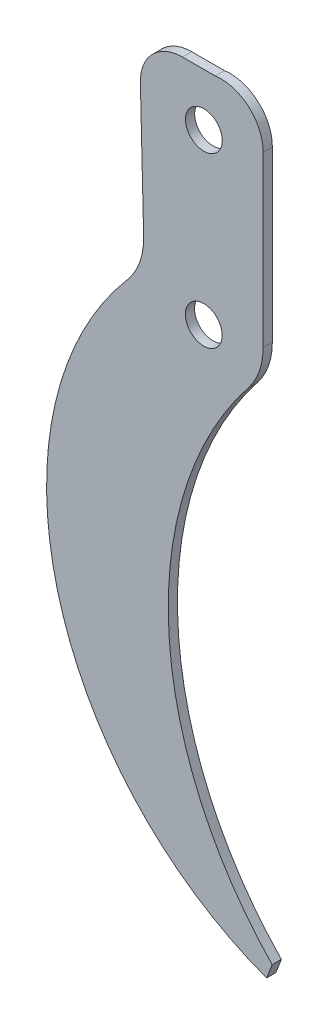
ISO-10303-21;
HEADER;
FILE_DESCRIPTION(('STEP AP214'),'2;1');
FILE_NAME('part.step','',(''),(''),'','','');
FILE_SCHEMA(('AUTOMOTIVE_DESIGN { 1 0 10303 214 1 1 1 1 }'));
ENDSEC;
DATA;
#1=APPLICATION_CONTEXT('core data for automotive mechanical design processes');
#2=APPLICATION_PROTOCOL_DEFINITION('international standard','automotive_design',2000,#1);
#3=PRODUCT_CONTEXT('',#1,'mechanical');
#4=PRODUCT('Part','Part','',(#3));
#5=PRODUCT_RELATED_PRODUCT_CATEGORY('part','',(#4));
#6=PRODUCT_DEFINITION_FORMATION('','',#4);
#7=PRODUCT_DEFINITION_CONTEXT('part definition',#1,'design');
#8=PRODUCT_DEFINITION('design','',#6,#7);
#9=PRODUCT_DEFINITION_SHAPE('','',#8);
#10=(LENGTH_UNIT() NAMED_UNIT(*) SI_UNIT(.MILLI.,.METRE.));
#11=(NAMED_UNIT(*) PLANE_ANGLE_UNIT() SI_UNIT($,.RADIAN.));
#12=(NAMED_UNIT(*) SI_UNIT($,.STERADIAN.) SOLID_ANGLE_UNIT());
#13=UNCERTAINTY_MEASURE_WITH_UNIT(LENGTH_MEASURE(1.E-05),#10,'distance_accuracy_value','');
#14=(GEOMETRIC_REPRESENTATION_CONTEXT(3) GLOBAL_UNCERTAINTY_ASSIGNED_CONTEXT((#13)) GLOBAL_UNIT_ASSIGNED_CONTEXT((#10,
#11,#12)) REPRESENTATION_CONTEXT('',''));
#15=CARTESIAN_POINT('',(0.,0.,0.));
#16=DIRECTION('',(0.,0.,1.));
#17=DIRECTION('',(1.,0.,0.));
#18=AXIS2_PLACEMENT_3D('',#15,#16,#17);
#19=CARTESIAN_POINT('',(7127.77049573772,3294.93047297352,15.));
#20=DIRECTION('',(0.,0.,1.));
#21=DIRECTION('',(1.,0.,0.));
#22=AXIS2_PLACEMENT_3D('',#19,#20,#21);
#23=PLANE('',#22);
#24=CARTESIAN_POINT('',(7127.77049573772,3294.93047297352,15.));
#25=DIRECTION('',(0.,0.,1.));
#26=DIRECTION('',(1.,0.,0.));
#27=AXIS2_PLACEMENT_3D('',#24,#25,#26);
#28=CIRCLE('',#27,549.387659983748);
#29=CARTESIAN_POINT('',(6710.2050521168,3651.95414338779,15.));
#30=VERTEX_POINT('',#29);
#31=CARTESIAN_POINT('',(6936.87895507785,2779.77300127489,15.));
#32=VERTEX_POINT('',#31);
#33=EDGE_CURVE('E145',#30,#32,#28,.T.);
#34=ORIENTED_EDGE('',*,*,#33,.T.);
#35=DIRECTION('',(0.362479633940397,0.931991692547973,0.));
#36=VECTOR('',#35,1.);
#37=CARTESIAN_POINT('',(6945.94094592636,2803.07279358859,15.));
#38=LINE('',#37,#36);
#39=CARTESIAN_POINT('',(6945.94094592636,2803.07279358859,15.));
#40=VERTEX_POINT('',#39);
#41=EDGE_CURVE('E83',#32,#40,#38,.T.);
#42=ORIENTED_EDGE('',*,*,#41,.T.);
#43=CARTESIAN_POINT('',(7380.92244872364,3222.59814605796,15.));
#44=DIRECTION('',(0.,0.,-1.));
#45=DIRECTION('',(1.,0.,0.));
#46=AXIS2_PLACEMENT_3D('',#43,#44,#45);
#47=CIRCLE('',#46,604.326425982123);
#48=CARTESIAN_POINT('',(6907.31914174979,3597.97840228325,15.));
#49=VERTEX_POINT('',#48);
#50=EDGE_CURVE('E166',#40,#49,#47,.T.);
#51=ORIENTED_EDGE('',*,*,#50,.T.);
#52=CARTESIAN_POINT('',(6821.31679547886,3666.36457393798,15.));
#53=DIRECTION('',(0.,0.,1.));
#54=DIRECTION('',(1.,0.,0.));
#55=AXIS2_PLACEMENT_3D('',#52,#53,#54);
#56=CIRCLE('',#55,109.877531996749);
#57=CARTESIAN_POINT('',(6931.19432747561,3666.36457393798,15.));
#58=VERTEX_POINT('',#57);
#59=EDGE_CURVE('E185',#49,#58,#56,.T.);
#60=ORIENTED_EDGE('',*,*,#59,.T.);
#61=DIRECTION('',(0.,1.,0.));
#62=VECTOR('',#61,1.);
#63=CARTESIAN_POINT('',(6931.19432747561,3942.08605991255,15.));
#64=LINE('',#63,#62);
#65=CARTESIAN_POINT('',(6931.19432747561,3942.08605991255,15.));
#66=VERTEX_POINT('',#65);
#67=EDGE_CURVE('E182',#58,#66,#64,.T.);
#68=ORIENTED_EDGE('',*,*,#67,.T.);
#69=CARTESIAN_POINT('',(6862.52400653347,3942.74240313722,15.));
#70=DIRECTION('',(0.,0.,1.));
#71=DIRECTION('',(1.,0.,0.));
#72=AXIS2_PLACEMENT_3D('',#69,#70,#71);
#73=CIRCLE('',#72,68.6734574979682);
#74=CARTESIAN_POINT('',(6853.05215715453,4010.75951741052,15.));
#75=VERTEX_POINT('',#74);
#76=EDGE_CURVE('E184',#66,#75,#73,.T.);
#77=ORIENTED_EDGE('',*,*,#76,.T.);
#78=DIRECTION('',(-1.,0.,0.));
#79=VECTOR('',#78,1.);
#80=CARTESIAN_POINT('',(6799.84646166127,4010.75951741052,15.));
#81=LINE('',#80,#79);
#82=CARTESIAN_POINT('',(6799.84646166127,4010.75951741052,15.));
#83=VERTEX_POINT('',#82);
#84=EDGE_CURVE('E108',#75,#83,#81,.T.);
#85=ORIENTED_EDGE('',*,*,#84,.T.);
#86=CARTESIAN_POINT('',(6799.84646166127,3942.08605991255,15.));
#87=DIRECTION('',(0.,0.,1.));
#88=DIRECTION('',(1.,0.,0.));
#89=AXIS2_PLACEMENT_3D('',#86,#87,#88);
#90=CIRCLE('',#89,68.6734574979682);
#91=CARTESIAN_POINT('',(6731.19432747561,3940.37485084327,15.));
#92=VERTEX_POINT('',#91);
#93=EDGE_CURVE('E102',#83,#92,#90,.T.);
#94=ORIENTED_EDGE('',*,*,#93,.T.);
#95=DIRECTION('',(0.0249180561402346,-0.99968949703305,0.));
#96=VECTOR('',#95,1.);
#97=CARTESIAN_POINT('',(6736.53537808965,3726.09681198145,15.));
#98=LINE('',#97,#96);
#99=CARTESIAN_POINT('',(6736.53537808965,3726.09681198145,15.));
#100=VERTEX_POINT('',#99);
#101=EDGE_CURVE('E106',#92,#100,#98,.T.);
#102=ORIENTED_EDGE('',*,*,#101,.T.);
#103=CARTESIAN_POINT('',(6626.69196339258,3723.35887747061,15.));
#104=DIRECTION('',(0.,0.,-1.));
#105=DIRECTION('',(1.,0.,0.));
#106=AXIS2_PLACEMENT_3D('',#103,#104,#105);
#107=CIRCLE('',#106,109.877531996749);
#108=EDGE_CURVE('E34',#100,#30,#107,.T.);
#109=ORIENTED_EDGE('',*,*,#108,.T.);
#110=EDGE_LOOP('',(#34,#42,#51,#60,#68,#77,#85,#94,#102,#109));
#111=FACE_BOUND('',#110,.T.);
#112=CARTESIAN_POINT('',(6834.46924200168,3650.21863180757,15.));
#113=DIRECTION('',(0.,0.,1.));
#114=DIRECTION('',(1.,0.,0.));
#115=AXIS2_PLACEMENT_3D('',#112,#113,#114);
#116=CIRCLE('',#115,30.);
#117=CARTESIAN_POINT('',(6864.46924200168,3650.21863180757,15.));
#118=VERTEX_POINT('',#117);
#119=EDGE_CURVE('E195',#118,#118,#116,.T.);
#120=ORIENTED_EDGE('',*,*,#119,.F.);
#121=EDGE_LOOP('',(#120));
#122=FACE_BOUND('',#121,.T.);
#123=CARTESIAN_POINT('',(6834.63264710738,3925.21863180757,15.));
#124=DIRECTION('',(0.,0.,1.));
#125=DIRECTION('',(1.,0.,0.));
#126=AXIS2_PLACEMENT_3D('',#123,#124,#125);
#127=CIRCLE('',#126,30.);
#128=CARTESIAN_POINT('',(6864.63264710738,3925.21863180757,15.));
#129=VERTEX_POINT('',#128);
#130=EDGE_CURVE('E201',#129,#129,#127,.T.);
#131=ORIENTED_EDGE('',*,*,#130,.F.);
#132=EDGE_LOOP('',(#131));
#133=FACE_BOUND('',#132,.T.);
#134=ADVANCED_FACE('F17',(#111,#122,#133),#23,.T.);
#135=CARTESIAN_POINT('',(7127.77049573772,3294.93047297352,0.));
#136=DIRECTION('',(0.,0.,1.));
#137=DIRECTION('',(1.,0.,0.));
#138=AXIS2_PLACEMENT_3D('',#135,#136,#137);
#139=PLANE('',#138);
#140=CARTESIAN_POINT('',(7127.77049573772,3294.93047297352,0.));
#141=DIRECTION('',(0.,0.,1.));
#142=DIRECTION('',(1.,0.,0.));
#143=AXIS2_PLACEMENT_3D('',#140,#141,#142);
#144=CIRCLE('',#143,549.387659983748);
#145=CARTESIAN_POINT('',(6710.2050521168,3651.95414338779,0.));
#146=VERTEX_POINT('',#145);
#147=CARTESIAN_POINT('',(6936.87895507785,2779.77300127489,0.));
#148=VERTEX_POINT('',#147);
#149=EDGE_CURVE('E126',#146,#148,#144,.T.);
#150=ORIENTED_EDGE('',*,*,#149,.F.);
#151=CARTESIAN_POINT('',(6626.69196339258,3723.35887747061,0.));
#152=DIRECTION('',(0.,0.,-1.));
#153=DIRECTION('',(1.,0.,0.));
#154=AXIS2_PLACEMENT_3D('',#151,#152,#153);
#155=CIRCLE('',#154,109.877531996749);
#156=CARTESIAN_POINT('',(6736.53537808965,3726.09681198145,0.));
#157=VERTEX_POINT('',#156);
#158=EDGE_CURVE('E75',#157,#146,#155,.T.);
#159=ORIENTED_EDGE('',*,*,#158,.F.);
#160=DIRECTION('',(0.0249180561402346,-0.99968949703305,0.));
#161=VECTOR('',#160,1.);
#162=CARTESIAN_POINT('',(6736.53537808965,3726.09681198145,0.));
#163=LINE('',#162,#161);
#164=CARTESIAN_POINT('',(6731.19432747561,3940.37485084327,0.));
#165=VERTEX_POINT('',#164);
#166=EDGE_CURVE('E69',#165,#157,#163,.T.);
#167=ORIENTED_EDGE('',*,*,#166,.F.);
#168=CARTESIAN_POINT('',(6799.84646166127,3942.08605991255,0.));
#169=DIRECTION('',(0.,0.,1.));
#170=DIRECTION('',(1.,0.,0.));
#171=AXIS2_PLACEMENT_3D('',#168,#169,#170);
#172=CIRCLE('',#171,68.6734574979682);
#173=CARTESIAN_POINT('',(6799.84646166127,4010.75951741052,0.));
#174=VERTEX_POINT('',#173);
#175=EDGE_CURVE('E116',#174,#165,#172,.T.);
#176=ORIENTED_EDGE('',*,*,#175,.F.);
#177=DIRECTION('',(-1.,0.,0.));
#178=VECTOR('',#177,1.);
#179=CARTESIAN_POINT('',(6799.84646166127,4010.75951741052,0.));
#180=LINE('',#179,#178);
#181=CARTESIAN_POINT('',(6853.05215715453,4010.75951741052,0.));
#182=VERTEX_POINT('',#181);
#183=EDGE_CURVE('E140',#182,#174,#180,.T.);
#184=ORIENTED_EDGE('',*,*,#183,.F.);
#185=CARTESIAN_POINT('',(6862.52400653347,3942.74240313722,0.));
#186=DIRECTION('',(0.,0.,1.));
#187=DIRECTION('',(1.,0.,0.));
#188=AXIS2_PLACEMENT_3D('',#185,#186,#187);
#189=CIRCLE('',#188,68.6734574979682);
#190=CARTESIAN_POINT('',(6931.19432747561,3942.08605991255,0.));
#191=VERTEX_POINT('',#190);
#192=EDGE_CURVE('E138',#191,#182,#189,.T.);
#193=ORIENTED_EDGE('',*,*,#192,.F.);
#194=DIRECTION('',(0.,1.,0.));
#195=VECTOR('',#194,1.);
#196=CARTESIAN_POINT('',(6931.19432747561,3942.08605991255,0.));
#197=LINE('',#196,#195);
#198=CARTESIAN_POINT('',(6931.19432747561,3666.36457393798,0.));
#199=VERTEX_POINT('',#198);
#200=EDGE_CURVE('E136',#199,#191,#197,.T.);
#201=ORIENTED_EDGE('',*,*,#200,.F.);
#202=CARTESIAN_POINT('',(6821.31679547886,3666.36457393798,0.));
#203=DIRECTION('',(0.,0.,1.));
#204=DIRECTION('',(1.,0.,0.));
#205=AXIS2_PLACEMENT_3D('',#202,#203,#204);
#206=CIRCLE('',#205,109.877531996749);
#207=CARTESIAN_POINT('',(6907.31914174979,3597.97840228325,0.));
#208=VERTEX_POINT('',#207);
#209=EDGE_CURVE('E134',#208,#199,#206,.T.);
#210=ORIENTED_EDGE('',*,*,#209,.F.);
#211=CARTESIAN_POINT('',(7380.92244872364,3222.59814605796,0.));
#212=DIRECTION('',(0.,0.,-1.));
#213=DIRECTION('',(1.,0.,0.));
#214=AXIS2_PLACEMENT_3D('',#211,#212,#213);
#215=CIRCLE('',#214,604.326425982123);
#216=CARTESIAN_POINT('',(6945.94094592636,2803.07279358859,0.));
#217=VERTEX_POINT('',#216);
#218=EDGE_CURVE('E132',#217,#208,#215,.T.);
#219=ORIENTED_EDGE('',*,*,#218,.F.);
#220=DIRECTION('',(0.362479633940397,0.931991692547973,0.));
#221=VECTOR('',#220,1.);
#222=CARTESIAN_POINT('',(6945.94094592636,2803.07279358859,0.));
#223=LINE('',#222,#221);
#224=EDGE_CURVE('E129',#148,#217,#223,.T.);
#225=ORIENTED_EDGE('',*,*,#224,.F.);
#226=EDGE_LOOP('',(#150,#159,#167,#176,#184,#193,#201,#210,#219,#225));
#227=FACE_BOUND('',#226,.T.);
#228=CARTESIAN_POINT('',(6834.46924200168,3650.21863180757,0.));
#229=DIRECTION('',(0.,0.,1.));
#230=DIRECTION('',(1.,0.,0.));
#231=AXIS2_PLACEMENT_3D('',#228,#229,#230);
#232=CIRCLE('',#231,30.);
#233=CARTESIAN_POINT('',(6864.46924200168,3650.21863180757,0.));
#234=VERTEX_POINT('',#233);
#235=EDGE_CURVE('E130',#234,#234,#232,.F.);
#236=ORIENTED_EDGE('',*,*,#235,.F.);
#237=EDGE_LOOP('',(#236));
#238=FACE_BOUND('',#237,.T.);
#239=CARTESIAN_POINT('',(6834.63264710738,3925.21863180757,0.));
#240=DIRECTION('',(0.,0.,1.));
#241=DIRECTION('',(1.,0.,0.));
#242=AXIS2_PLACEMENT_3D('',#239,#240,#241);
#243=CIRCLE('',#242,30.);
#244=CARTESIAN_POINT('',(6864.63264710738,3925.21863180757,0.));
#245=VERTEX_POINT('',#244);
#246=EDGE_CURVE('E198',#245,#245,#243,.F.);
#247=ORIENTED_EDGE('',*,*,#246,.F.);
#248=EDGE_LOOP('',(#247));
#249=FACE_BOUND('',#248,.T.);
#250=ADVANCED_FACE('F170',(#227,#238,#249),#139,.F.);
#251=CARTESIAN_POINT('',(7127.77049573772,3294.93047297352,15.));
#252=DIRECTION('',(0.,0.,-1.));
#253=DIRECTION('',(-1.,0.,0.));
#254=AXIS2_PLACEMENT_3D('',#251,#252,#253);
#255=CYLINDRICAL_SURFACE('',#254,549.387659983748);
#256=ORIENTED_EDGE('',*,*,#149,.T.);
#257=DIRECTION('',(0.,0.,-1.));
#258=VECTOR('',#257,1.);
#259=CARTESIAN_POINT('',(6936.87895507785,2779.77300127489,15.));
#260=LINE('',#259,#258);
#261=EDGE_CURVE('E11',#32,#148,#260,.T.);
#262=ORIENTED_EDGE('',*,*,#261,.F.);
#263=ORIENTED_EDGE('',*,*,#33,.F.);
#264=DIRECTION('',(0.,0.,-1.));
#265=VECTOR('',#264,1.);
#266=CARTESIAN_POINT('',(6710.2050521168,3651.95414338779,15.));
#267=LINE('',#266,#265);
#268=EDGE_CURVE('E122',#30,#146,#267,.T.);
#269=ORIENTED_EDGE('',*,*,#268,.T.);
#270=EDGE_LOOP('',(#256,#262,#263,#269));
#271=FACE_BOUND('',#270,.T.);
#272=ADVANCED_FACE('F19',(#271),#255,.T.);
#273=CARTESIAN_POINT('',(6945.94094592636,2803.07279358859,15.));
#274=DIRECTION('',(-0.931991692547973,0.362479633940397,0.));
#275=DIRECTION('',(-0.362479633940397,-0.931991692547973,0.));
#276=AXIS2_PLACEMENT_3D('',#273,#274,#275);
#277=PLANE('',#276);
#278=ORIENTED_EDGE('',*,*,#224,.T.);
#279=DIRECTION('',(0.,0.,-1.));
#280=VECTOR('',#279,1.);
#281=CARTESIAN_POINT('',(6945.94094592636,2803.07279358859,15.));
#282=LINE('',#281,#280);
#283=EDGE_CURVE('E26',#40,#217,#282,.T.);
#284=ORIENTED_EDGE('',*,*,#283,.F.);
#285=ORIENTED_EDGE('',*,*,#41,.F.);
#286=ORIENTED_EDGE('',*,*,#261,.T.);
#287=EDGE_LOOP('',(#278,#284,#285,#286));
#288=FACE_BOUND('',#287,.T.);
#289=ADVANCED_FACE('F239',(#288),#277,.F.);
#290=CARTESIAN_POINT('',(7380.92244872364,3222.59814605796,15.));
#291=DIRECTION('',(0.,0.,-1.));
#292=DIRECTION('',(-1.,0.,0.));
#293=AXIS2_PLACEMENT_3D('',#290,#291,#292);
#294=CYLINDRICAL_SURFACE('',#293,604.326425982123);
#295=ORIENTED_EDGE('',*,*,#218,.T.);
#296=DIRECTION('',(0.,0.,-1.));
#297=VECTOR('',#296,1.);
#298=CARTESIAN_POINT('',(6907.31914174979,3597.97840228325,15.));
#299=LINE('',#298,#297);
#300=EDGE_CURVE('E158',#49,#208,#299,.T.);
#301=ORIENTED_EDGE('',*,*,#300,.F.);
#302=ORIENTED_EDGE('',*,*,#50,.F.);
#303=ORIENTED_EDGE('',*,*,#283,.T.);
#304=EDGE_LOOP('',(#295,#301,#302,#303));
#305=FACE_BOUND('',#304,.T.);
#306=ADVANCED_FACE('F164',(#305),#294,.F.);
#307=CARTESIAN_POINT('',(6821.31679547886,3666.36457393798,15.));
#308=DIRECTION('',(0.,0.,-1.));
#309=DIRECTION('',(-1.,0.,0.));
#310=AXIS2_PLACEMENT_3D('',#307,#308,#309);
#311=CYLINDRICAL_SURFACE('',#310,109.877531996749);
#312=ORIENTED_EDGE('',*,*,#209,.T.);
#313=DIRECTION('',(0.,0.,-1.));
#314=VECTOR('',#313,1.);
#315=CARTESIAN_POINT('',(6931.19432747561,3666.36457393798,15.));
#316=LINE('',#315,#314);
#317=EDGE_CURVE('E155',#58,#199,#316,.T.);
#318=ORIENTED_EDGE('',*,*,#317,.F.);
#319=ORIENTED_EDGE('',*,*,#59,.F.);
#320=ORIENTED_EDGE('',*,*,#300,.T.);
#321=EDGE_LOOP('',(#312,#318,#319,#320));
#322=FACE_BOUND('',#321,.T.);
#323=ADVANCED_FACE('F176',(#322),#311,.T.);
#324=CARTESIAN_POINT('',(6931.19432747561,3942.08605991255,15.));
#325=DIRECTION('',(-1.,0.,0.));
#326=DIRECTION('',(0.,0.,1.));
#327=AXIS2_PLACEMENT_3D('',#324,#325,#326);
#328=PLANE('',#327);
#329=ORIENTED_EDGE('',*,*,#200,.T.);
#330=DIRECTION('',(0.,0.,-1.));
#331=VECTOR('',#330,1.);
#332=CARTESIAN_POINT('',(6931.19432747561,3942.08605991255,15.));
#333=LINE('',#332,#331);
#334=EDGE_CURVE('E152',#66,#191,#333,.T.);
#335=ORIENTED_EDGE('',*,*,#334,.F.);
#336=ORIENTED_EDGE('',*,*,#67,.F.);
#337=ORIENTED_EDGE('',*,*,#317,.T.);
#338=EDGE_LOOP('',(#329,#335,#336,#337));
#339=FACE_BOUND('',#338,.T.);
#340=ADVANCED_FACE('F180',(#339),#328,.F.);
#341=CARTESIAN_POINT('',(6862.52400653347,3942.74240313722,15.));
#342=DIRECTION('',(0.,0.,-1.));
#343=DIRECTION('',(-1.,0.,0.));
#344=AXIS2_PLACEMENT_3D('',#341,#342,#343);
#345=CYLINDRICAL_SURFACE('',#344,68.6734574979682);
#346=ORIENTED_EDGE('',*,*,#192,.T.);
#347=DIRECTION('',(0.,0.,-1.));
#348=VECTOR('',#347,1.);
#349=CARTESIAN_POINT('',(6853.05215715453,4010.75951741052,15.));
#350=LINE('',#349,#348);
#351=EDGE_CURVE('E149',#75,#182,#350,.T.);
#352=ORIENTED_EDGE('',*,*,#351,.F.);
#353=ORIENTED_EDGE('',*,*,#76,.F.);
#354=ORIENTED_EDGE('',*,*,#334,.T.);
#355=EDGE_LOOP('',(#346,#352,#353,#354));
#356=FACE_BOUND('',#355,.T.);
#357=ADVANCED_FACE('F229',(#356),#345,.T.);
#358=CARTESIAN_POINT('',(6799.84646166127,4010.75951741052,15.));
#359=DIRECTION('',(0.,-1.,0.));
#360=DIRECTION('',(1.,0.,0.));
#361=AXIS2_PLACEMENT_3D('',#358,#359,#360);
#362=PLANE('',#361);
#363=ORIENTED_EDGE('',*,*,#183,.T.);
#364=DIRECTION('',(0.,0.,-1.));
#365=VECTOR('',#364,1.);
#366=CARTESIAN_POINT('',(6799.84646166127,4010.75951741052,15.));
#367=LINE('',#366,#365);
#368=EDGE_CURVE('E117',#83,#174,#367,.T.);
#369=ORIENTED_EDGE('',*,*,#368,.F.);
#370=ORIENTED_EDGE('',*,*,#84,.F.);
#371=ORIENTED_EDGE('',*,*,#351,.T.);
#372=EDGE_LOOP('',(#363,#369,#370,#371));
#373=FACE_BOUND('',#372,.T.);
#374=ADVANCED_FACE('F226',(#373),#362,.F.);
#375=CARTESIAN_POINT('',(6799.84646166127,3942.08605991255,15.));
#376=DIRECTION('',(0.,0.,-1.));
#377=DIRECTION('',(-1.,0.,0.));
#378=AXIS2_PLACEMENT_3D('',#375,#376,#377);
#379=CYLINDRICAL_SURFACE('',#378,68.6734574979682);
#380=ORIENTED_EDGE('',*,*,#175,.T.);
#381=DIRECTION('',(0.,0.,-1.));
#382=VECTOR('',#381,1.);
#383=CARTESIAN_POINT('',(6731.19432747561,3940.37485084327,15.));
#384=LINE('',#383,#382);
#385=EDGE_CURVE('E113',#92,#165,#384,.T.);
#386=ORIENTED_EDGE('',*,*,#385,.F.);
#387=ORIENTED_EDGE('',*,*,#93,.F.);
#388=ORIENTED_EDGE('',*,*,#368,.T.);
#389=EDGE_LOOP('',(#380,#386,#387,#388));
#390=FACE_BOUND('',#389,.T.);
#391=ADVANCED_FACE('F114',(#390),#379,.T.);
#392=CARTESIAN_POINT('',(6736.53537808965,3726.09681198145,15.));
#393=DIRECTION('',(0.99968949703305,0.0249180561402346,0.));
#394=DIRECTION('',(-0.0249180561402346,0.99968949703305,0.));
#395=AXIS2_PLACEMENT_3D('',#392,#393,#394);
#396=PLANE('',#395);
#397=ORIENTED_EDGE('',*,*,#166,.T.);
#398=DIRECTION('',(0.,0.,-1.));
#399=VECTOR('',#398,1.);
#400=CARTESIAN_POINT('',(6736.53537808965,3726.09681198145,15.));
#401=LINE('',#400,#399);
#402=EDGE_CURVE('E118',#100,#157,#401,.T.);
#403=ORIENTED_EDGE('',*,*,#402,.F.);
#404=ORIENTED_EDGE('',*,*,#101,.F.);
#405=ORIENTED_EDGE('',*,*,#385,.T.);
#406=EDGE_LOOP('',(#397,#403,#404,#405));
#407=FACE_BOUND('',#406,.T.);
#408=ADVANCED_FACE('F120',(#407),#396,.F.);
#409=CARTESIAN_POINT('',(6626.69196339258,3723.35887747061,15.));
#410=DIRECTION('',(0.,0.,-1.));
#411=DIRECTION('',(-1.,0.,0.));
#412=AXIS2_PLACEMENT_3D('',#409,#410,#411);
#413=CYLINDRICAL_SURFACE('',#412,109.877531996749);
#414=ORIENTED_EDGE('',*,*,#158,.T.);
#415=ORIENTED_EDGE('',*,*,#268,.F.);
#416=ORIENTED_EDGE('',*,*,#108,.F.);
#417=ORIENTED_EDGE('',*,*,#402,.T.);
#418=EDGE_LOOP('',(#414,#415,#416,#417));
#419=FACE_BOUND('',#418,.T.);
#420=ADVANCED_FACE('F219',(#419),#413,.F.);
#421=CARTESIAN_POINT('',(6834.46924200168,3650.21863180757,-113.137084989848));
#422=DIRECTION('',(0.,0.,1.));
#423=DIRECTION('',(1.,0.,0.));
#424=AXIS2_PLACEMENT_3D('',#421,#422,#423);
#425=CYLINDRICAL_SURFACE('',#424,30.);
#426=ORIENTED_EDGE('',*,*,#235,.T.);
#427=EDGE_LOOP('',(#426));
#428=FACE_BOUND('',#427,.T.);
#429=ORIENTED_EDGE('',*,*,#119,.T.);
#430=EDGE_LOOP('',(#429));
#431=FACE_BOUND('',#430,.T.);
#432=ADVANCED_FACE('F216',(#428,#431),#425,.F.);
#433=CARTESIAN_POINT('',(6834.63264710738,3925.21863180757,-113.137084989848));
#434=DIRECTION('',(0.,0.,1.));
#435=DIRECTION('',(1.,0.,0.));
#436=AXIS2_PLACEMENT_3D('',#433,#434,#435);
#437=CYLINDRICAL_SURFACE('',#436,30.);
#438=ORIENTED_EDGE('',*,*,#246,.T.);
#439=EDGE_LOOP('',(#438));
#440=FACE_BOUND('',#439,.T.);
#441=ORIENTED_EDGE('',*,*,#130,.T.);
#442=EDGE_LOOP('',(#441));
#443=FACE_BOUND('',#442,.T.);
#444=ADVANCED_FACE('F205',(#440,#443),#437,.F.);
#445=CLOSED_SHELL('',(#134,#250,#272,#289,#306,#323,#340,#357,#374,#391,#408,#420,#432,#444));
#446=MANIFOLD_SOLID_BREP('B1',#445);
#447=ADVANCED_BREP_SHAPE_REPRESENTATION('',(#18,#446),#14);
#448=SHAPE_DEFINITION_REPRESENTATION(#9,#447);
ENDSEC;
END-ISO-10303-21;
